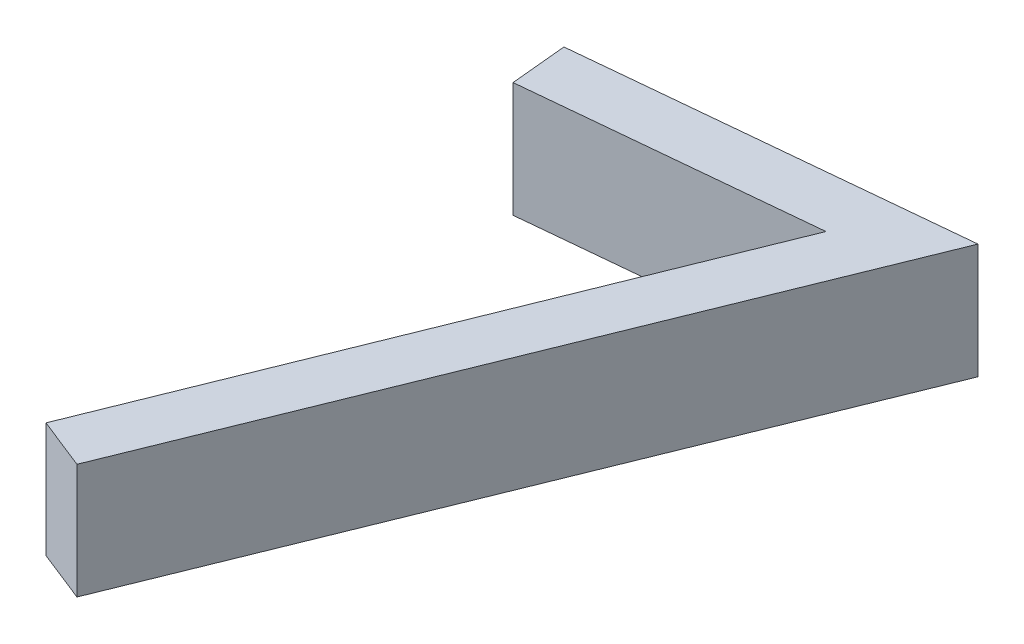
ISO-10303-21;
HEADER;
FILE_DESCRIPTION(('STEP AP214'),'2;1');
FILE_NAME('part.step','',(''),(''),'','','');
FILE_SCHEMA(('AUTOMOTIVE_DESIGN { 1 0 10303 214 1 1 1 1 }'));
ENDSEC;
DATA;
#1=APPLICATION_CONTEXT('core data for automotive mechanical design processes');
#2=APPLICATION_PROTOCOL_DEFINITION('international standard','automotive_design',2000,#1);
#3=PRODUCT_CONTEXT('',#1,'mechanical');
#4=PRODUCT('Part','Part','',(#3));
#5=PRODUCT_RELATED_PRODUCT_CATEGORY('part','',(#4));
#6=PRODUCT_DEFINITION_FORMATION('','',#4);
#7=PRODUCT_DEFINITION_CONTEXT('part definition',#1,'design');
#8=PRODUCT_DEFINITION('design','',#6,#7);
#9=PRODUCT_DEFINITION_SHAPE('','',#8);
#10=(LENGTH_UNIT() NAMED_UNIT(*) SI_UNIT(.MILLI.,.METRE.));
#11=(NAMED_UNIT(*) PLANE_ANGLE_UNIT() SI_UNIT($,.RADIAN.));
#12=(NAMED_UNIT(*) SI_UNIT($,.STERADIAN.) SOLID_ANGLE_UNIT());
#13=UNCERTAINTY_MEASURE_WITH_UNIT(LENGTH_MEASURE(1.E-05),#10,'distance_accuracy_value','');
#14=(GEOMETRIC_REPRESENTATION_CONTEXT(3) GLOBAL_UNCERTAINTY_ASSIGNED_CONTEXT((#13)) GLOBAL_UNIT_ASSIGNED_CONTEXT((#10,
#11,#12)) REPRESENTATION_CONTEXT('',''));
#15=CARTESIAN_POINT('',(0.,0.,0.));
#16=DIRECTION('',(0.,0.,1.));
#17=DIRECTION('',(1.,0.,0.));
#18=AXIS2_PLACEMENT_3D('',#15,#16,#17);
#19=CARTESIAN_POINT('',(0.647670559296145,8.128,14.7256053551183));
#20=DIRECTION('',(-0.995428452026915,0.,0.0955101926251841));
#21=DIRECTION('',(0.0955101926251841,0.,0.995428452026915));
#22=AXIS2_PLACEMENT_3D('',#19,#20,#21);
#23=PLANE('',#22);
#24=DIRECTION('',(0.0955101926252098,0.,0.995428452026913));
#25=VECTOR('',#24,1.);
#26=CARTESIAN_POINT('',(0.623819898238453,8.128,14.4770284654282));
#27=LINE('',#26,#25);
#28=CARTESIAN_POINT('',(0.623819898238456,8.128,14.4770284654282));
#29=VERTEX_POINT('',#28);
#30=CARTESIAN_POINT('',(0.647670559296146,8.128,14.7256053551183));
#31=VERTEX_POINT('',#30);
#32=EDGE_CURVE('E120',#29,#31,#27,.T.);
#33=ORIENTED_EDGE('',*,*,#32,.F.);
#34=DIRECTION('',(0.,1.,0.));
#35=VECTOR('',#34,1.);
#36=CARTESIAN_POINT('',(0.623819898238453,8.128,14.4770284654282));
#37=LINE('',#36,#35);
#38=CARTESIAN_POINT('',(0.623819898238455,7.62,14.4770284654282));
#39=VERTEX_POINT('',#38);
#40=EDGE_CURVE('E86',#39,#29,#37,.T.);
#41=ORIENTED_EDGE('',*,*,#40,.F.);
#42=DIRECTION('',(0.0955101926252098,0.,0.995428452026913));
#43=VECTOR('',#42,1.);
#44=CARTESIAN_POINT('',(0.623819898238453,7.62,14.4770284654282));
#45=LINE('',#44,#43);
#46=CARTESIAN_POINT('',(0.647670559296147,7.62,14.7256053551183));
#47=VERTEX_POINT('',#46);
#48=EDGE_CURVE('E96',#39,#47,#45,.T.);
#49=ORIENTED_EDGE('',*,*,#48,.T.);
#50=DIRECTION('',(0.,1.,0.));
#51=VECTOR('',#50,1.);
#52=CARTESIAN_POINT('',(0.647670559296149,8.128,14.7256053551183));
#53=LINE('',#52,#51);
#54=EDGE_CURVE('E19',#31,#47,#53,.F.);
#55=ORIENTED_EDGE('',*,*,#54,.F.);
#56=EDGE_LOOP('',(#33,#41,#49,#55));
#57=FACE_BOUND('',#56,.T.);
#58=ADVANCED_FACE('F16',(#57),#23,.T.);
#59=CARTESIAN_POINT('',(1.90910552190298,8.128,14.6042319910692));
#60=DIRECTION('',(0.0957761610791912,0.,0.995402896805576));
#61=DIRECTION('',(0.995402896805576,0.,-0.0957761610791912));
#62=AXIS2_PLACEMENT_3D('',#59,#60,#61);
#63=PLANE('',#62);
#64=DIRECTION('',(0.99540289680558,0.,-0.0957761610791561));
#65=VECTOR('',#64,1.);
#66=CARTESIAN_POINT('',(0.647670559296145,8.128,14.7256053551183));
#67=LINE('',#66,#65);
#68=CARTESIAN_POINT('',(1.90910552190298,8.128,14.6042319910692));
#69=VERTEX_POINT('',#68);
#70=EDGE_CURVE('E105',#31,#69,#67,.T.);
#71=ORIENTED_EDGE('',*,*,#70,.F.);
#72=ORIENTED_EDGE('',*,*,#54,.T.);
#73=DIRECTION('',(0.99540289680558,0.,-0.0957761610791561));
#74=VECTOR('',#73,1.);
#75=CARTESIAN_POINT('',(0.647670559296145,7.62,14.7256053551183));
#76=LINE('',#75,#74);
#77=CARTESIAN_POINT('',(1.90910552190298,7.62,14.6042319910692));
#78=VERTEX_POINT('',#77);
#79=EDGE_CURVE('E69',#47,#78,#76,.T.);
#80=ORIENTED_EDGE('',*,*,#79,.T.);
#81=DIRECTION('',(0.,1.,0.));
#82=VECTOR('',#81,1.);
#83=CARTESIAN_POINT('',(1.90910552190299,8.128,14.6042319910692));
#84=LINE('',#83,#82);
#85=EDGE_CURVE('E72',#69,#78,#84,.F.);
#86=ORIENTED_EDGE('',*,*,#85,.F.);
#87=EDGE_LOOP('',(#71,#72,#80,#86));
#88=FACE_BOUND('',#87,.T.);
#89=ADVANCED_FACE('F71',(#88),#63,.T.);
#90=CARTESIAN_POINT('',(0.917978051283324,8.128,17.0597900506312));
#91=DIRECTION('',(-0.927312653969775,0.,-0.37428764578534));
#92=DIRECTION('',(-0.37428764578534,0.,0.927312653969775));
#93=AXIS2_PLACEMENT_3D('',#90,#91,#92);
#94=PLANE('',#93);
#95=DIRECTION('',(-0.374287645785335,0.,0.927312653969777));
#96=VECTOR('',#95,1.);
#97=CARTESIAN_POINT('',(1.90910552190298,8.128,14.6042319910692));
#98=LINE('',#97,#96);
#99=CARTESIAN_POINT('',(0.917978051283329,8.128,17.0597900506312));
#100=VERTEX_POINT('',#99);
#101=EDGE_CURVE('E84',#69,#100,#98,.T.);
#102=ORIENTED_EDGE('',*,*,#101,.F.);
#103=ORIENTED_EDGE('',*,*,#85,.T.);
#104=DIRECTION('',(-0.374287645785335,0.,0.927312653969777));
#105=VECTOR('',#104,1.);
#106=CARTESIAN_POINT('',(1.90910552190298,7.62,14.6042319910692));
#107=LINE('',#106,#105);
#108=CARTESIAN_POINT('',(0.917978051283329,7.62,17.0597900506312));
#109=VERTEX_POINT('',#108);
#110=EDGE_CURVE('E77',#78,#109,#107,.T.);
#111=ORIENTED_EDGE('',*,*,#110,.T.);
#112=DIRECTION('',(0.,1.,0.));
#113=VECTOR('',#112,1.);
#114=CARTESIAN_POINT('',(0.917978051283324,8.128,17.0597900506312));
#115=LINE('',#114,#113);
#116=EDGE_CURVE('E87',#109,#100,#115,.T.);
#117=ORIENTED_EDGE('',*,*,#116,.T.);
#118=EDGE_LOOP('',(#102,#103,#111,#117));
#119=FACE_BOUND('',#118,.T.);
#120=ADVANCED_FACE('F82',(#119),#94,.T.);
#121=CARTESIAN_POINT('',(0.623819898238453,8.128,14.4770284654282));
#122=DIRECTION('',(-0.0957786614275857,0.,-0.995402656222667));
#123=DIRECTION('',(-0.995402656222667,0.,0.0957786614275857));
#124=AXIS2_PLACEMENT_3D('',#121,#122,#123);
#125=PLANE('',#124);
#126=DIRECTION('',(-0.995402656222666,0.,0.0957786614275889));
#127=VECTOR('',#126,1.);
#128=CARTESIAN_POINT('',(2.29283615758674,8.128,14.3164340143064));
#129=LINE('',#128,#127);
#130=CARTESIAN_POINT('',(2.29283615758674,8.128,14.3164340143064));
#131=VERTEX_POINT('',#130);
#132=EDGE_CURVE('E106',#131,#29,#129,.T.);
#133=ORIENTED_EDGE('',*,*,#132,.F.);
#134=DIRECTION('',(0.,1.,0.));
#135=VECTOR('',#134,1.);
#136=CARTESIAN_POINT('',(2.29283615758674,8.128,14.3164340143064));
#137=LINE('',#136,#135);
#138=CARTESIAN_POINT('',(2.29283615758674,7.62,14.3164340143064));
#139=VERTEX_POINT('',#138);
#140=EDGE_CURVE('E78',#131,#139,#137,.F.);
#141=ORIENTED_EDGE('',*,*,#140,.T.);
#142=DIRECTION('',(-0.995402656222666,0.,0.0957786614275889));
#143=VECTOR('',#142,1.);
#144=CARTESIAN_POINT('',(2.29283615758674,7.62,14.3164340143064));
#145=LINE('',#144,#143);
#146=EDGE_CURVE('E93',#139,#39,#145,.T.);
#147=ORIENTED_EDGE('',*,*,#146,.T.);
#148=ORIENTED_EDGE('',*,*,#40,.T.);
#149=EDGE_LOOP('',(#133,#141,#147,#148));
#150=FACE_BOUND('',#149,.T.);
#151=ADVANCED_FACE('F126',(#150),#125,.T.);
#152=CARTESIAN_POINT('',(0.647670559296145,7.62,14.7256053551183));
#153=DIRECTION('',(0.,1.,0.));
#154=DIRECTION('',(0.,0.,1.));
#155=AXIS2_PLACEMENT_3D('',#152,#153,#154);
#156=PLANE('',#155);
#157=ORIENTED_EDGE('',*,*,#146,.F.);
#158=DIRECTION('',(0.375511939357238,0.,-0.92681755669612));
#159=VECTOR('',#158,1.);
#160=CARTESIAN_POINT('',(2.29283615758674,7.62,14.3164340143064));
#161=LINE('',#160,#159);
#162=CARTESIAN_POINT('',(1.14482433867649,7.62,17.1498925479602));
#163=VERTEX_POINT('',#162);
#164=EDGE_CURVE('E110',#163,#139,#161,.T.);
#165=ORIENTED_EDGE('',*,*,#164,.F.);
#166=DIRECTION('',(0.929372496781413,0.,0.369143281431862));
#167=VECTOR('',#166,1.);
#168=CARTESIAN_POINT('',(1.14482433867649,7.62,17.1498925479602));
#169=LINE('',#168,#167);
#170=EDGE_CURVE('E92',#109,#163,#169,.T.);
#171=ORIENTED_EDGE('',*,*,#170,.F.);
#172=ORIENTED_EDGE('',*,*,#110,.F.);
#173=ORIENTED_EDGE('',*,*,#79,.F.);
#174=ORIENTED_EDGE('',*,*,#48,.F.);
#175=EDGE_LOOP('',(#157,#165,#171,#172,#173,#174));
#176=FACE_BOUND('',#175,.T.);
#177=ADVANCED_FACE('F90',(#176),#156,.F.);
#178=CARTESIAN_POINT('',(0.647670559296145,8.128,14.7256053551183));
#179=DIRECTION('',(0.,1.,0.));
#180=DIRECTION('',(0.,0.,1.));
#181=AXIS2_PLACEMENT_3D('',#178,#179,#180);
#182=PLANE('',#181);
#183=DIRECTION('',(0.375511939357238,0.,-0.92681755669612));
#184=VECTOR('',#183,1.);
#185=CARTESIAN_POINT('',(2.29283615758674,8.128,14.3164340143064));
#186=LINE('',#185,#184);
#187=CARTESIAN_POINT('',(1.14482433867649,8.128,17.1498925479602));
#188=VERTEX_POINT('',#187);
#189=EDGE_CURVE('E25',#131,#188,#186,.F.);
#190=ORIENTED_EDGE('',*,*,#189,.F.);
#191=ORIENTED_EDGE('',*,*,#132,.T.);
#192=ORIENTED_EDGE('',*,*,#32,.T.);
#193=ORIENTED_EDGE('',*,*,#70,.T.);
#194=ORIENTED_EDGE('',*,*,#101,.T.);
#195=DIRECTION('',(0.929372496781413,0.,0.369143281431862));
#196=VECTOR('',#195,1.);
#197=CARTESIAN_POINT('',(1.14482433867649,8.128,17.1498925479602));
#198=LINE('',#197,#196);
#199=EDGE_CURVE('E34',#188,#100,#198,.F.);
#200=ORIENTED_EDGE('',*,*,#199,.F.);
#201=EDGE_LOOP('',(#190,#191,#192,#193,#194,#200));
#202=FACE_BOUND('',#201,.T.);
#203=ADVANCED_FACE('F103',(#202),#182,.T.);
#204=CARTESIAN_POINT('',(1.14482433867649,8.128,17.1498925479602));
#205=DIRECTION('',(-0.369143281431862,0.,0.929372496781413));
#206=DIRECTION('',(0.929372496781413,0.,0.369143281431862));
#207=AXIS2_PLACEMENT_3D('',#204,#205,#206);
#208=PLANE('',#207);
#209=ORIENTED_EDGE('',*,*,#199,.T.);
#210=ORIENTED_EDGE('',*,*,#116,.F.);
#211=ORIENTED_EDGE('',*,*,#170,.T.);
#212=DIRECTION('',(0.,1.,0.));
#213=VECTOR('',#212,1.);
#214=CARTESIAN_POINT('',(1.1448243386765,8.128,17.1498925479602));
#215=LINE('',#214,#213);
#216=EDGE_CURVE('E11',#188,#163,#215,.F.);
#217=ORIENTED_EDGE('',*,*,#216,.F.);
#218=EDGE_LOOP('',(#209,#210,#211,#217));
#219=FACE_BOUND('',#218,.T.);
#220=ADVANCED_FACE('F108',(#219),#208,.T.);
#221=CARTESIAN_POINT('',(2.29283615758674,8.128,14.3164340143064));
#222=DIRECTION('',(0.92681755669612,0.,0.375511939357238));
#223=DIRECTION('',(0.375511939357238,0.,-0.92681755669612));
#224=AXIS2_PLACEMENT_3D('',#221,#222,#223);
#225=PLANE('',#224);
#226=ORIENTED_EDGE('',*,*,#189,.T.);
#227=ORIENTED_EDGE('',*,*,#216,.T.);
#228=ORIENTED_EDGE('',*,*,#164,.T.);
#229=ORIENTED_EDGE('',*,*,#140,.F.);
#230=EDGE_LOOP('',(#226,#227,#228,#229));
#231=FACE_BOUND('',#230,.T.);
#232=ADVANCED_FACE('F124',(#231),#225,.T.);
#233=CLOSED_SHELL('',(#58,#89,#120,#151,#177,#203,#220,#232));
#234=MANIFOLD_SOLID_BREP('B1',#233);
#235=ADVANCED_BREP_SHAPE_REPRESENTATION('',(#18,#234),#14);
#236=SHAPE_DEFINITION_REPRESENTATION(#9,#235);
ENDSEC;
END-ISO-10303-21;
